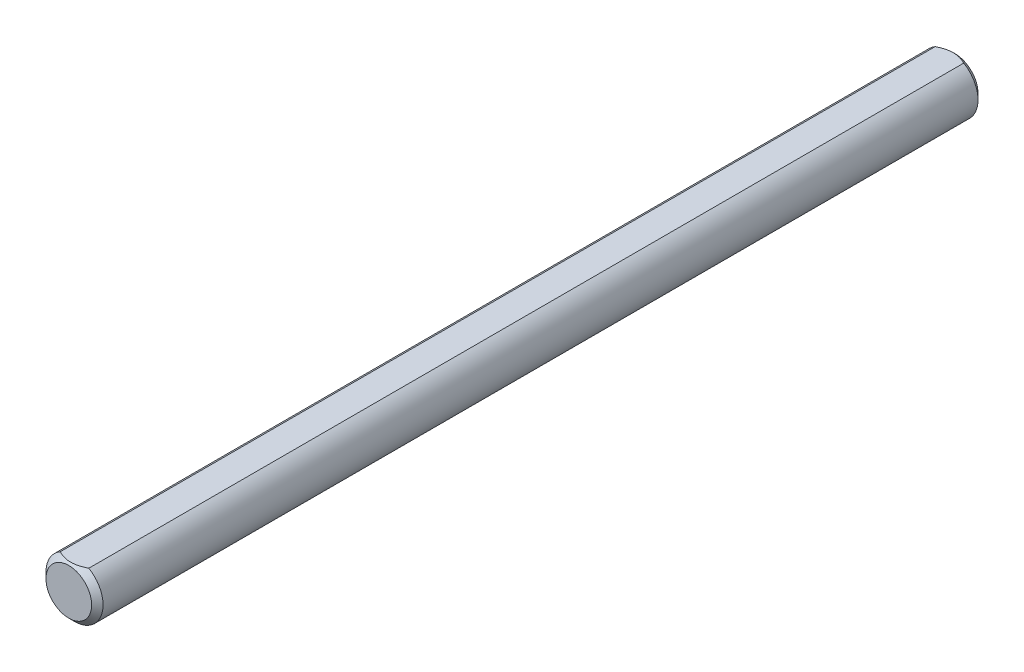
ISO-10303-21;
HEADER;
FILE_DESCRIPTION(('STEP AP214'),'2;1');
FILE_NAME('part.step','',(''),(''),'','','');
FILE_SCHEMA(('AUTOMOTIVE_DESIGN { 1 0 10303 214 1 1 1 1 }'));
ENDSEC;
DATA;
#1=APPLICATION_CONTEXT('core data for automotive mechanical design processes');
#2=APPLICATION_PROTOCOL_DEFINITION('international standard','automotive_design',2000,#1);
#3=PRODUCT_CONTEXT('',#1,'mechanical');
#4=PRODUCT('Part','Part','',(#3));
#5=PRODUCT_RELATED_PRODUCT_CATEGORY('part','',(#4));
#6=PRODUCT_DEFINITION_FORMATION('','',#4);
#7=PRODUCT_DEFINITION_CONTEXT('part definition',#1,'design');
#8=PRODUCT_DEFINITION('design','',#6,#7);
#9=PRODUCT_DEFINITION_SHAPE('','',#8);
#10=(LENGTH_UNIT() NAMED_UNIT(*) SI_UNIT(.MILLI.,.METRE.));
#11=(NAMED_UNIT(*) PLANE_ANGLE_UNIT() SI_UNIT($,.RADIAN.));
#12=(NAMED_UNIT(*) SI_UNIT($,.STERADIAN.) SOLID_ANGLE_UNIT());
#13=UNCERTAINTY_MEASURE_WITH_UNIT(LENGTH_MEASURE(1.E-05),#10,'distance_accuracy_value','');
#14=(GEOMETRIC_REPRESENTATION_CONTEXT(3) GLOBAL_UNCERTAINTY_ASSIGNED_CONTEXT((#13)) GLOBAL_UNIT_ASSIGNED_CONTEXT((#10,
#11,#12)) REPRESENTATION_CONTEXT('',''));
#15=CARTESIAN_POINT('',(0.,0.,0.));
#16=DIRECTION('',(0.,0.,1.));
#17=DIRECTION('',(1.,0.,0.));
#18=AXIS2_PLACEMENT_3D('',#15,#16,#17);
#19=CARTESIAN_POINT('',(0.,0.,49.276));
#20=DIRECTION('',(0.,0.,-1.));
#21=DIRECTION('',(-1.,0.,0.));
#22=AXIS2_PLACEMENT_3D('',#19,#20,#21);
#23=CYLINDRICAL_SURFACE('',#22,3.175);
#24=CARTESIAN_POINT('',(0.,0.,48.641));
#25=DIRECTION('',(0.,0.,1.));
#26=DIRECTION('',(1.,0.,0.));
#27=AXIS2_PLACEMENT_3D('',#24,#25,#26);
#28=CIRCLE('',#27,3.175);
#29=CARTESIAN_POINT('',(1.5875,2.74963065701559,48.641));
#30=VERTEX_POINT('',#29);
#31=CARTESIAN_POINT('',(-1.5875,2.74963065701559,48.641));
#32=VERTEX_POINT('',#31);
#33=EDGE_CURVE('E74',#30,#32,#28,.F.);
#34=ORIENTED_EDGE('',*,*,#33,.T.);
#35=DIRECTION('',(0.,0.,1.));
#36=VECTOR('',#35,1.);
#37=CARTESIAN_POINT('',(-1.5875,2.74963065701559,-49.276));
#38=LINE('',#37,#36);
#39=CARTESIAN_POINT('',(-1.5875,2.74963065701559,-48.6409999999999));
#40=VERTEX_POINT('',#39);
#41=EDGE_CURVE('E52',#40,#32,#38,.T.);
#42=ORIENTED_EDGE('',*,*,#41,.F.);
#43=CARTESIAN_POINT('',(0.,0.,-48.6409999999999));
#44=DIRECTION('',(0.,0.,1.));
#45=DIRECTION('',(1.,0.,0.));
#46=AXIS2_PLACEMENT_3D('',#43,#44,#45);
#47=CIRCLE('',#46,3.175);
#48=CARTESIAN_POINT('',(1.5875,2.74963065701559,-48.6409999999999));
#49=VERTEX_POINT('',#48);
#50=EDGE_CURVE('E73',#40,#49,#47,.T.);
#51=ORIENTED_EDGE('',*,*,#50,.T.);
#52=DIRECTION('',(0.,0.,1.));
#53=VECTOR('',#52,1.);
#54=CARTESIAN_POINT('',(1.5875,2.74963065701559,-49.276));
#55=LINE('',#54,#53);
#56=EDGE_CURVE('E62',#49,#30,#55,.T.);
#57=ORIENTED_EDGE('',*,*,#56,.T.);
#58=EDGE_LOOP('',(#34,#42,#51,#57));
#59=FACE_BOUND('',#58,.T.);
#60=ADVANCED_FACE('F33',(#59),#23,.T.);
#61=CARTESIAN_POINT('',(0.,0.,49.276));
#62=DIRECTION('',(0.,0.,1.));
#63=DIRECTION('',(1.,0.,0.));
#64=AXIS2_PLACEMENT_3D('',#61,#62,#63);
#65=PLANE('',#64);
#66=CARTESIAN_POINT('',(0.,0.,49.276));
#67=DIRECTION('',(0.,0.,1.));
#68=DIRECTION('',(1.,0.,0.));
#69=AXIS2_PLACEMENT_3D('',#66,#67,#68);
#70=CIRCLE('',#69,2.54000000000001);
#71=CARTESIAN_POINT('',(2.54000000000001,0.,49.276));
#72=VERTEX_POINT('',#71);
#73=EDGE_CURVE('E46',#72,#72,#70,.T.);
#74=ORIENTED_EDGE('',*,*,#73,.T.);
#75=EDGE_LOOP('',(#74));
#76=FACE_BOUND('',#75,.T.);
#77=ADVANCED_FACE('F84',(#76),#65,.T.);
#78=CARTESIAN_POINT('',(0.,0.,-49.276));
#79=DIRECTION('',(0.,0.,1.));
#80=DIRECTION('',(1.,0.,0.));
#81=AXIS2_PLACEMENT_3D('',#78,#79,#80);
#82=PLANE('',#81);
#83=CARTESIAN_POINT('',(0.,0.,-49.276));
#84=DIRECTION('',(0.,0.,1.));
#85=DIRECTION('',(1.,0.,0.));
#86=AXIS2_PLACEMENT_3D('',#83,#84,#85);
#87=CIRCLE('',#86,2.53999999999993);
#88=CARTESIAN_POINT('',(2.53999999999993,0.,-49.276));
#89=VERTEX_POINT('',#88);
#90=EDGE_CURVE('E76',#89,#89,#87,.F.);
#91=ORIENTED_EDGE('',*,*,#90,.T.);
#92=EDGE_LOOP('',(#91));
#93=FACE_BOUND('',#92,.T.);
#94=ADVANCED_FACE('F92',(#93),#82,.F.);
#95=CARTESIAN_POINT('',(0.,0.,-48.6409999999999));
#96=DIRECTION('',(0.,0.,1.));
#97=DIRECTION('',(1.,0.,0.));
#98=AXIS2_PLACEMENT_3D('',#95,#96,#97);
#99=CONICAL_SURFACE('',#98,3.175,0.785398163397463);
#100=CARTESIAN_POINT('',(-3.22896135223731,2.74963065701559,-47.5749317189837));
#101=CARTESIAN_POINT('',(-3.15061649550106,2.74963065701559,-47.634566524546));
#102=CARTESIAN_POINT('',(-3.07184009651264,2.74963065701559,-47.693643482025));
#103=CARTESIAN_POINT('',(-2.91325130568819,2.74963065701559,-47.8104297176183));
#104=CARTESIAN_POINT('',(-2.83343866506295,2.74963065701559,-47.8681386575258));
#105=CARTESIAN_POINT('',(-2.67202062852746,2.74963065701559,-47.9823475478051));
#106=CARTESIAN_POINT('',(-2.59040613970429,2.74963065701559,-48.0388346895371));
#107=CARTESIAN_POINT('',(-2.42580311622164,2.74963065701559,-48.1497635143344));
#108=CARTESIAN_POINT('',(-2.34281467809334,2.74963065701559,-48.2042053402285));
#109=CARTESIAN_POINT('',(-2.17021447787228,2.74963065701559,-48.3137738711656));
#110=CARTESIAN_POINT('',(-2.08050398524192,2.74963065701559,-48.3687458353402));
#111=CARTESIAN_POINT('',(-1.89900904678691,2.74963065701559,-48.4751469931978));
#112=CARTESIAN_POINT('',(-1.80722487525634,2.74963065701559,-48.5265766518349));
#113=CARTESIAN_POINT('',(-1.62153760368929,2.74963065701559,-48.6248148050514));
#114=CARTESIAN_POINT('',(-1.52764140922493,2.74963065701559,-48.6716362501767));
#115=CARTESIAN_POINT('',(-1.33724706572099,2.74963065701559,-48.7596008153406));
#116=CARTESIAN_POINT('',(-1.24075014112707,2.74963065701559,-48.8007465535942));
#117=CARTESIAN_POINT('',(-1.05364742760747,2.74963065701559,-48.8725564372305));
#118=CARTESIAN_POINT('',(-0.963276425588624,2.74963065701559,-48.9038260439732));
#119=CARTESIAN_POINT('',(-0.780303735161084,2.74963065701559,-48.9591231873504));
#120=CARTESIAN_POINT('',(-0.687701898779439,2.74963065701559,-48.9831502421446));
#121=CARTESIAN_POINT('',(-0.502391431282825,2.74963065701559,-49.0222882908411));
#122=CARTESIAN_POINT('',(-0.409716445146727,2.74963065701559,-49.0375559547489));
#123=CARTESIAN_POINT('',(-0.223306330685234,2.74963065701559,-49.0588688420293));
#124=CARTESIAN_POINT('',(-0.129571403437334,2.74963065701559,-49.0649157860141));
#125=CARTESIAN_POINT('',(0.0543357559017133,2.74963065701559,-49.0673094852484));
#126=CARTESIAN_POINT('',(0.144503242552404,2.74963065701559,-49.0640280862278));
#127=CARTESIAN_POINT('',(0.32409554357345,2.74963065701559,-49.0487817719637));
#128=CARTESIAN_POINT('',(0.413520286896905,2.74963065701559,-49.0368160354813));
#129=CARTESIAN_POINT('',(0.592496066024113,2.74963065701559,-49.0046615235361));
#130=CARTESIAN_POINT('',(0.68202117737906,2.74963065701559,-48.9843305801751));
#131=CARTESIAN_POINT('',(0.859103373963868,2.74963065701559,-48.9365451979539));
#132=CARTESIAN_POINT('',(0.946660601088829,2.74963065701559,-48.9090912745012));
#133=CARTESIAN_POINT('',(1.21954622680469,2.74963065701559,-48.8131294821896));
#134=CARTESIAN_POINT('',(1.40108594012674,2.74963065701559,-48.7338094527362));
#135=CARTESIAN_POINT('',(1.6667588948987,2.74963065701559,-48.6015539852256));
#136=CARTESIAN_POINT('',(1.75437488385027,2.74963065701559,-48.5551526611237));
#137=CARTESIAN_POINT('',(1.92761951465613,2.74963065701559,-48.4587692377676));
#138=CARTESIAN_POINT('',(2.01324850705469,2.74963065701559,-48.4087877765755));
#139=CARTESIAN_POINT('',(2.1785518428575,2.74963065701559,-48.308513843306));
#140=CARTESIAN_POINT('',(2.25831097248816,2.74963065701559,-48.2583595590395));
#141=CARTESIAN_POINT('',(2.41646118640014,2.74963065701559,-48.1559282177624));
#142=CARTESIAN_POINT('',(2.49485216688195,2.74963065701559,-48.1036510006804));
#143=CARTESIAN_POINT('',(2.64980987258647,2.74963065701559,-47.9977831250553));
#144=CARTESIAN_POINT('',(2.72638621983978,2.74963065701559,-47.9442064917737));
#145=CARTESIAN_POINT('',(2.87849044969187,2.74963065701559,-47.8356270900168));
#146=CARTESIAN_POINT('',(2.95401861519283,2.74963065701559,-47.7806247183089));
#147=CARTESIAN_POINT('',(3.02910770969645,2.74963065701559,-47.7250389555824));
#148=B_SPLINE_CURVE_WITH_KNOTS('',3,(#100,#101,#102,#103,#104,#105,#106,#107,#108,#109,#110,
#111,#112,#113,#114,#115,#116,#117,#118,#119,#120,#121,#122,#123,#124,#125,#126,#127,#128,#129,
#130,#131,#132,#133,#134,#135,#136,#137,#138,#139,#140,#141,#142,#143,#144,#145,#146,#147),
.UNSPECIFIED.,.F.,.F.,(4,2,2,2,2,2,2,2,2,2,2,2,2,2,2,2,2,2,2,2,2,2,2,4),(0.,0.295383449271209,
0.590839178498792,0.888580871622955,1.1863017339907,1.50187785569756,1.81741247644346,
2.13203338294822,2.44650866534176,2.73314264689636,3.01979569373834,3.30114758261626,
3.58244696402028,3.85269226293496,4.1229631210719,4.39803055604401,4.67307809311875,
5.2655707124132,5.56297998480391,5.86033638333479,6.14295523590893,6.42559543796941,
6.70595195130137,6.98623126477286),.UNSPECIFIED.);
#149=EDGE_CURVE('E57',#49,#40,#148,.F.);
#150=ORIENTED_EDGE('',*,*,#149,.F.);
#151=ORIENTED_EDGE('',*,*,#50,.F.);
#152=EDGE_LOOP('',(#150,#151));
#153=FACE_BOUND('',#152,.T.);
#154=ORIENTED_EDGE('',*,*,#90,.F.);
#155=EDGE_LOOP('',(#154));
#156=FACE_BOUND('',#155,.T.);
#157=ADVANCED_FACE('F71',(#153,#156),#99,.T.);
#158=CARTESIAN_POINT('',(0.,0.,49.276));
#159=DIRECTION('',(0.,0.,-1.));
#160=DIRECTION('',(-1.,0.,0.));
#161=AXIS2_PLACEMENT_3D('',#158,#159,#160);
#162=CONICAL_SURFACE('',#161,2.54000000000001,0.785398163397452);
#163=CARTESIAN_POINT('',(-3.22896135223731,2.74963065701559,47.5749317189838));
#164=CARTESIAN_POINT('',(-3.15061649550106,2.74963065701559,47.634566524546));
#165=CARTESIAN_POINT('',(-3.07184009651265,2.74963065701559,47.693643482025));
#166=CARTESIAN_POINT('',(-2.9132513056882,2.74963065701559,47.8104297176183));
#167=CARTESIAN_POINT('',(-2.83343866506295,2.74963065701559,47.8681386575258));
#168=CARTESIAN_POINT('',(-2.67202062852747,2.74963065701559,47.9823475478051));
#169=CARTESIAN_POINT('',(-2.59040613970429,2.74963065701559,48.0388346895372));
#170=CARTESIAN_POINT('',(-2.42580311622164,2.74963065701559,48.1497635143344));
#171=CARTESIAN_POINT('',(-2.34281467809335,2.74963065701559,48.2042053402285));
#172=CARTESIAN_POINT('',(-2.17021447787229,2.74963065701559,48.3137738711657));
#173=CARTESIAN_POINT('',(-2.08050398524193,2.74963065701559,48.3687458353402));
#174=CARTESIAN_POINT('',(-1.89900904678691,2.74963065701559,48.4751469931979));
#175=CARTESIAN_POINT('',(-1.80722487525635,2.74963065701559,48.5265766518349));
#176=CARTESIAN_POINT('',(-1.6215376036893,2.74963065701559,48.6248148050514));
#177=CARTESIAN_POINT('',(-1.52764140922494,2.74963065701559,48.6716362501767));
#178=CARTESIAN_POINT('',(-1.337247065721,2.74963065701559,48.7596008153407));
#179=CARTESIAN_POINT('',(-1.24075014112708,2.74963065701559,48.8007465535942));
#180=CARTESIAN_POINT('',(-1.05364742760749,2.74963065701559,48.8725564372305));
#181=CARTESIAN_POINT('',(-0.963276425588639,2.74963065701559,48.9038260439733));
#182=CARTESIAN_POINT('',(-0.780303735161101,2.74963065701559,48.9591231873505));
#183=CARTESIAN_POINT('',(-0.687701898779457,2.74963065701559,48.9831502421446));
#184=CARTESIAN_POINT('',(-0.502391431282845,2.74963065701559,49.0222882908411));
#185=CARTESIAN_POINT('',(-0.409716445146748,2.74963065701559,49.0375559547489));
#186=CARTESIAN_POINT('',(-0.223306330685259,2.74963065701559,49.0588688420294));
#187=CARTESIAN_POINT('',(-0.12957140343736,2.74963065701559,49.0649157860141));
#188=CARTESIAN_POINT('',(0.0543357559016855,2.74963065701559,49.0673094852485));
#189=CARTESIAN_POINT('',(0.144503242552375,2.74963065701559,49.0640280862279));
#190=CARTESIAN_POINT('',(0.32409554357342,2.74963065701559,49.0487817719638));
#191=CARTESIAN_POINT('',(0.413520286896874,2.74963065701559,49.0368160354814));
#192=CARTESIAN_POINT('',(0.59249606602408,2.74963065701559,49.0046615235361));
#193=CARTESIAN_POINT('',(0.682021177379026,2.74963065701559,48.9843305801752));
#194=CARTESIAN_POINT('',(0.859103373963833,2.74963065701559,48.936545197954));
#195=CARTESIAN_POINT('',(0.946660601088793,2.74963065701559,48.9090912745013));
#196=CARTESIAN_POINT('',(1.21954622680464,2.74963065701559,48.8131294821897));
#197=CARTESIAN_POINT('',(1.40108594012667,2.74963065701559,48.7338094527363));
#198=CARTESIAN_POINT('',(1.66675889489862,2.74963065701559,48.6015539852257));
#199=CARTESIAN_POINT('',(1.75437488385019,2.74963065701559,48.5551526611238));
#200=CARTESIAN_POINT('',(1.92761951465604,2.74963065701559,48.4587692377677));
#201=CARTESIAN_POINT('',(2.0132485070546,2.74963065701559,48.4087877765756));
#202=CARTESIAN_POINT('',(2.17855184285741,2.74963065701559,48.3085138433061));
#203=CARTESIAN_POINT('',(2.25831097248805,2.74963065701559,48.2583595590396));
#204=CARTESIAN_POINT('',(2.41646118640002,2.74963065701559,48.1559282177625));
#205=CARTESIAN_POINT('',(2.49485216688183,2.74963065701559,48.1036510006805));
#206=CARTESIAN_POINT('',(2.64980987258635,2.74963065701559,47.9977831250554));
#207=CARTESIAN_POINT('',(2.72638621983965,2.74963065701559,47.9442064917739));
#208=CARTESIAN_POINT('',(2.87849044969173,2.74963065701559,47.8356270900169));
#209=CARTESIAN_POINT('',(2.95401861519268,2.74963065701559,47.780624718309));
#210=CARTESIAN_POINT('',(3.0291077096963,2.74963065701559,47.7250389555825));
#211=B_SPLINE_CURVE_WITH_KNOTS('',3,(#163,#164,#165,#166,#167,#168,#169,#170,#171,#172,#173,
#174,#175,#176,#177,#178,#179,#180,#181,#182,#183,#184,#185,#186,#187,#188,#189,#190,#191,#192,
#193,#194,#195,#196,#197,#198,#199,#200,#201,#202,#203,#204,#205,#206,#207,#208,#209,#210),
.UNSPECIFIED.,.F.,.F.,(4,2,2,2,2,2,2,2,2,2,2,2,2,2,2,2,2,2,2,2,2,2,2,4),(0.,0.295383449271205,
0.590839178498788,0.88858087162295,1.1863017339907,1.50187785569756,1.81741247644347,
2.13203338294822,2.44650866534175,2.73314264689635,3.01979569373833,3.30114758261625,
3.58244696402026,3.85269226293494,4.12296312107188,4.39803055604399,4.67307809311872,
5.26557071241313,5.56297998480383,5.8603363833347,6.14295523590883,6.42559543796929,
6.70595195130123,6.9862312647727),.UNSPECIFIED.);
#212=EDGE_CURVE('E11',#32,#30,#211,.T.);
#213=ORIENTED_EDGE('',*,*,#212,.F.);
#214=ORIENTED_EDGE('',*,*,#33,.F.);
#215=EDGE_LOOP('',(#213,#214));
#216=FACE_BOUND('',#215,.T.);
#217=ORIENTED_EDGE('',*,*,#73,.F.);
#218=EDGE_LOOP('',(#217));
#219=FACE_BOUND('',#218,.T.);
#220=ADVANCED_FACE('F35',(#216,#219),#162,.T.);
#221=CARTESIAN_POINT('',(-1.5875,2.74963065701559,-49.276));
#222=DIRECTION('',(0.,-1.,0.));
#223=DIRECTION('',(0.,0.,-1.));
#224=AXIS2_PLACEMENT_3D('',#221,#222,#223);
#225=PLANE('',#224);
#226=ORIENTED_EDGE('',*,*,#149,.T.);
#227=ORIENTED_EDGE('',*,*,#41,.T.);
#228=ORIENTED_EDGE('',*,*,#212,.T.);
#229=ORIENTED_EDGE('',*,*,#56,.F.);
#230=EDGE_LOOP('',(#226,#227,#228,#229));
#231=FACE_BOUND('',#230,.T.);
#232=ADVANCED_FACE('F63',(#231),#225,.F.);
#233=CLOSED_SHELL('',(#60,#77,#94,#157,#220,#232));
#234=MANIFOLD_SOLID_BREP('B2',#233);
#235=ADVANCED_BREP_SHAPE_REPRESENTATION('',(#18,#234),#14);
#236=SHAPE_DEFINITION_REPRESENTATION(#9,#235);
ENDSEC;
END-ISO-10303-21;
